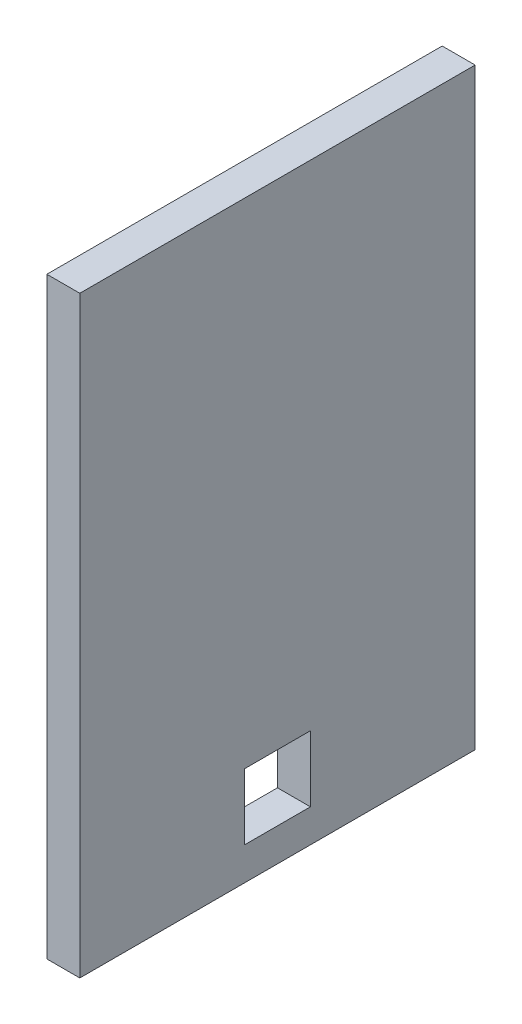
ISO-10303-21;
HEADER;
FILE_DESCRIPTION(('STEP AP214'),'2;1');
FILE_NAME('part.step','',(''),(''),'','','');
FILE_SCHEMA(('AUTOMOTIVE_DESIGN { 1 0 10303 214 1 1 1 1 }'));
ENDSEC;
DATA;
#1=APPLICATION_CONTEXT('core data for automotive mechanical design processes');
#2=APPLICATION_PROTOCOL_DEFINITION('international standard','automotive_design',2000,#1);
#3=PRODUCT_CONTEXT('',#1,'mechanical');
#4=PRODUCT('Part','Part','',(#3));
#5=PRODUCT_RELATED_PRODUCT_CATEGORY('part','',(#4));
#6=PRODUCT_DEFINITION_FORMATION('','',#4);
#7=PRODUCT_DEFINITION_CONTEXT('part definition',#1,'design');
#8=PRODUCT_DEFINITION('design','',#6,#7);
#9=PRODUCT_DEFINITION_SHAPE('','',#8);
#10=(LENGTH_UNIT() NAMED_UNIT(*) SI_UNIT(.MILLI.,.METRE.));
#11=(NAMED_UNIT(*) PLANE_ANGLE_UNIT() SI_UNIT($,.RADIAN.));
#12=(NAMED_UNIT(*) SI_UNIT($,.STERADIAN.) SOLID_ANGLE_UNIT());
#13=UNCERTAINTY_MEASURE_WITH_UNIT(LENGTH_MEASURE(1.E-05),#10,'distance_accuracy_value','');
#14=(GEOMETRIC_REPRESENTATION_CONTEXT(3) GLOBAL_UNCERTAINTY_ASSIGNED_CONTEXT((#13)) GLOBAL_UNIT_ASSIGNED_CONTEXT((#10,
#11,#12)) REPRESENTATION_CONTEXT('',''));
#15=CARTESIAN_POINT('',(0.,0.,0.));
#16=DIRECTION('',(0.,0.,1.));
#17=DIRECTION('',(1.,0.,0.));
#18=AXIS2_PLACEMENT_3D('',#15,#16,#17);
#19=CARTESIAN_POINT('',(-25.4,0.,152.4));
#20=DIRECTION('',(0.,0.,1.));
#21=DIRECTION('',(1.,0.,0.));
#22=AXIS2_PLACEMENT_3D('',#19,#20,#21);
#23=PLANE('',#22);
#24=DIRECTION('',(0.,-1.,0.));
#25=VECTOR('',#24,1.);
#26=CARTESIAN_POINT('',(0.,0.,152.4));
#27=LINE('',#26,#25);
#28=CARTESIAN_POINT('',(0.,457.2,152.4));
#29=VERTEX_POINT('',#28);
#30=CARTESIAN_POINT('',(0.,0.,152.4));
#31=VERTEX_POINT('',#30);
#32=EDGE_CURVE('E157',#29,#31,#27,.T.);
#33=ORIENTED_EDGE('',*,*,#32,.F.);
#34=DIRECTION('',(1.,0.,0.));
#35=VECTOR('',#34,1.);
#36=CARTESIAN_POINT('',(0.,457.2,152.4));
#37=LINE('',#36,#35);
#38=CARTESIAN_POINT('',(-25.4,457.2,152.4));
#39=VERTEX_POINT('',#38);
#40=EDGE_CURVE('E124',#39,#29,#37,.T.);
#41=ORIENTED_EDGE('',*,*,#40,.F.);
#42=DIRECTION('',(0.,-1.,0.));
#43=VECTOR('',#42,1.);
#44=CARTESIAN_POINT('',(-25.4,0.,152.4));
#45=LINE('',#44,#43);
#46=CARTESIAN_POINT('',(-25.4,0.,152.4));
#47=VERTEX_POINT('',#46);
#48=EDGE_CURVE('E109',#39,#47,#45,.T.);
#49=ORIENTED_EDGE('',*,*,#48,.T.);
#50=DIRECTION('',(1.,0.,0.));
#51=VECTOR('',#50,1.);
#52=CARTESIAN_POINT('',(-25.4,0.,152.4));
#53=LINE('',#52,#51);
#54=EDGE_CURVE('E38',#47,#31,#53,.T.);
#55=ORIENTED_EDGE('',*,*,#54,.T.);
#56=EDGE_LOOP('',(#33,#41,#49,#55));
#57=FACE_BOUND('',#56,.T.);
#58=ADVANCED_FACE('F35',(#57),#23,.T.);
#59=CARTESIAN_POINT('',(-25.4,0.,-152.4));
#60=DIRECTION('',(0.,0.,-1.));
#61=DIRECTION('',(0.,1.,0.));
#62=AXIS2_PLACEMENT_3D('',#59,#60,#61);
#63=PLANE('',#62);
#64=DIRECTION('',(0.,1.,0.));
#65=VECTOR('',#64,1.);
#66=CARTESIAN_POINT('',(0.,0.,-152.4));
#67=LINE('',#66,#65);
#68=CARTESIAN_POINT('',(0.,0.,-152.4));
#69=VERTEX_POINT('',#68);
#70=CARTESIAN_POINT('',(0.,457.2,-152.4));
#71=VERTEX_POINT('',#70);
#72=EDGE_CURVE('E100',#69,#71,#67,.T.);
#73=ORIENTED_EDGE('',*,*,#72,.F.);
#74=DIRECTION('',(1.,0.,0.));
#75=VECTOR('',#74,1.);
#76=CARTESIAN_POINT('',(-25.4,0.,-152.4));
#77=LINE('',#76,#75);
#78=CARTESIAN_POINT('',(-25.4,0.,-152.4));
#79=VERTEX_POINT('',#78);
#80=EDGE_CURVE('E11',#79,#69,#77,.T.);
#81=ORIENTED_EDGE('',*,*,#80,.F.);
#82=DIRECTION('',(0.,1.,0.));
#83=VECTOR('',#82,1.);
#84=CARTESIAN_POINT('',(-25.4,0.,-152.4));
#85=LINE('',#84,#83);
#86=CARTESIAN_POINT('',(-25.4,457.2,-152.4));
#87=VERTEX_POINT('',#86);
#88=EDGE_CURVE('E115',#79,#87,#85,.T.);
#89=ORIENTED_EDGE('',*,*,#88,.T.);
#90=DIRECTION('',(-1.,0.,0.));
#91=VECTOR('',#90,1.);
#92=CARTESIAN_POINT('',(0.,457.2,-152.4));
#93=LINE('',#92,#91);
#94=EDGE_CURVE('E112',#71,#87,#93,.T.);
#95=ORIENTED_EDGE('',*,*,#94,.F.);
#96=EDGE_LOOP('',(#73,#81,#89,#95));
#97=FACE_BOUND('',#96,.T.);
#98=ADVANCED_FACE('F113',(#97),#63,.T.);
#99=CARTESIAN_POINT('',(-25.4,0.,152.4));
#100=DIRECTION('',(0.,-1.,0.));
#101=DIRECTION('',(0.,0.,-1.));
#102=AXIS2_PLACEMENT_3D('',#99,#100,#101);
#103=PLANE('',#102);
#104=DIRECTION('',(0.,0.,-1.));
#105=VECTOR('',#104,1.);
#106=CARTESIAN_POINT('',(0.,0.,152.4));
#107=LINE('',#106,#105);
#108=EDGE_CURVE('E107',#31,#69,#107,.T.);
#109=ORIENTED_EDGE('',*,*,#108,.F.);
#110=ORIENTED_EDGE('',*,*,#54,.F.);
#111=DIRECTION('',(0.,0.,-1.));
#112=VECTOR('',#111,1.);
#113=CARTESIAN_POINT('',(-25.4,0.,152.4));
#114=LINE('',#113,#112);
#115=EDGE_CURVE('E160',#47,#79,#114,.T.);
#116=ORIENTED_EDGE('',*,*,#115,.T.);
#117=ORIENTED_EDGE('',*,*,#80,.T.);
#118=EDGE_LOOP('',(#109,#110,#116,#117));
#119=FACE_BOUND('',#118,.T.);
#120=ADVANCED_FACE('F168',(#119),#103,.T.);
#121=CARTESIAN_POINT('',(-25.4,0.,0.));
#122=DIRECTION('',(-1.,0.,0.));
#123=DIRECTION('',(0.,0.,1.));
#124=AXIS2_PLACEMENT_3D('',#121,#122,#123);
#125=PLANE('',#124);
#126=DIRECTION('',(0.,0.,1.));
#127=VECTOR('',#126,1.);
#128=CARTESIAN_POINT('',(-25.4,76.2,25.4));
#129=LINE('',#128,#127);
#130=CARTESIAN_POINT('',(-25.4,76.2,-25.4));
#131=VERTEX_POINT('',#130);
#132=CARTESIAN_POINT('',(-25.4,76.2,25.4));
#133=VERTEX_POINT('',#132);
#134=EDGE_CURVE('E131',#131,#133,#129,.T.);
#135=ORIENTED_EDGE('',*,*,#134,.T.);
#136=DIRECTION('',(0.,-1.,0.));
#137=VECTOR('',#136,1.);
#138=CARTESIAN_POINT('',(-25.4,25.4,25.4));
#139=LINE('',#138,#137);
#140=CARTESIAN_POINT('',(-25.4,25.4,25.4));
#141=VERTEX_POINT('',#140);
#142=EDGE_CURVE('E150',#133,#141,#139,.T.);
#143=ORIENTED_EDGE('',*,*,#142,.T.);
#144=DIRECTION('',(0.,0.,-1.));
#145=VECTOR('',#144,1.);
#146=CARTESIAN_POINT('',(-25.4,25.4,25.4));
#147=LINE('',#146,#145);
#148=CARTESIAN_POINT('',(-25.4,25.4,-25.4));
#149=VERTEX_POINT('',#148);
#150=EDGE_CURVE('E146',#141,#149,#147,.T.);
#151=ORIENTED_EDGE('',*,*,#150,.T.);
#152=DIRECTION('',(0.,1.,0.));
#153=VECTOR('',#152,1.);
#154=CARTESIAN_POINT('',(-25.4,25.4,-25.4));
#155=LINE('',#154,#153);
#156=EDGE_CURVE('E142',#149,#131,#155,.T.);
#157=ORIENTED_EDGE('',*,*,#156,.T.);
#158=EDGE_LOOP('',(#135,#143,#151,#157));
#159=FACE_BOUND('',#158,.T.);
#160=ORIENTED_EDGE('',*,*,#48,.F.);
#161=DIRECTION('',(0.,0.,1.));
#162=VECTOR('',#161,1.);
#163=CARTESIAN_POINT('',(-25.4,457.2,-152.4));
#164=LINE('',#163,#162);
#165=EDGE_CURVE('E119',#87,#39,#164,.T.);
#166=ORIENTED_EDGE('',*,*,#165,.F.);
#167=ORIENTED_EDGE('',*,*,#88,.F.);
#168=ORIENTED_EDGE('',*,*,#115,.F.);
#169=EDGE_LOOP('',(#160,#166,#167,#168));
#170=FACE_BOUND('',#169,.T.);
#171=ADVANCED_FACE('F170',(#159,#170),#125,.T.);
#172=CARTESIAN_POINT('',(0.,0.,0.));
#173=DIRECTION('',(-1.,0.,0.));
#174=DIRECTION('',(0.,0.,1.));
#175=AXIS2_PLACEMENT_3D('',#172,#173,#174);
#176=PLANE('',#175);
#177=DIRECTION('',(0.,-1.,0.));
#178=VECTOR('',#177,1.);
#179=CARTESIAN_POINT('',(0.,25.4,25.4));
#180=LINE('',#179,#178);
#181=CARTESIAN_POINT('',(0.,76.2,25.4));
#182=VERTEX_POINT('',#181);
#183=CARTESIAN_POINT('',(0.,25.4,25.4));
#184=VERTEX_POINT('',#183);
#185=EDGE_CURVE('E132',#182,#184,#180,.T.);
#186=ORIENTED_EDGE('',*,*,#185,.F.);
#187=DIRECTION('',(0.,0.,1.));
#188=VECTOR('',#187,1.);
#189=CARTESIAN_POINT('',(0.,76.2,25.4));
#190=LINE('',#189,#188);
#191=CARTESIAN_POINT('',(0.,76.2,-25.4));
#192=VERTEX_POINT('',#191);
#193=EDGE_CURVE('E135',#192,#182,#190,.T.);
#194=ORIENTED_EDGE('',*,*,#193,.F.);
#195=DIRECTION('',(0.,1.,0.));
#196=VECTOR('',#195,1.);
#197=CARTESIAN_POINT('',(0.,25.4,-25.4));
#198=LINE('',#197,#196);
#199=CARTESIAN_POINT('',(0.,25.4,-25.4));
#200=VERTEX_POINT('',#199);
#201=EDGE_CURVE('E129',#200,#192,#198,.T.);
#202=ORIENTED_EDGE('',*,*,#201,.F.);
#203=DIRECTION('',(0.,0.,-1.));
#204=VECTOR('',#203,1.);
#205=CARTESIAN_POINT('',(0.,25.4,25.4));
#206=LINE('',#205,#204);
#207=EDGE_CURVE('E57',#184,#200,#206,.T.);
#208=ORIENTED_EDGE('',*,*,#207,.F.);
#209=EDGE_LOOP('',(#186,#194,#202,#208));
#210=FACE_BOUND('',#209,.T.);
#211=ORIENTED_EDGE('',*,*,#32,.T.);
#212=ORIENTED_EDGE('',*,*,#108,.T.);
#213=ORIENTED_EDGE('',*,*,#72,.T.);
#214=DIRECTION('',(0.,0.,-1.));
#215=VECTOR('',#214,1.);
#216=CARTESIAN_POINT('',(0.,457.2,-152.4));
#217=LINE('',#216,#215);
#218=EDGE_CURVE('E105',#29,#71,#217,.T.);
#219=ORIENTED_EDGE('',*,*,#218,.F.);
#220=EDGE_LOOP('',(#211,#212,#213,#219));
#221=FACE_BOUND('',#220,.T.);
#222=ADVANCED_FACE('F103',(#210,#221),#176,.F.);
#223=CARTESIAN_POINT('',(-97.2420489685532,76.2,25.4));
#224=DIRECTION('',(0.,1.,0.));
#225=DIRECTION('',(0.,0.,1.));
#226=AXIS2_PLACEMENT_3D('',#223,#224,#225);
#227=PLANE('',#226);
#228=DIRECTION('',(1.,0.,0.));
#229=VECTOR('',#228,1.);
#230=CARTESIAN_POINT('',(-97.2420489685532,76.2,-25.4));
#231=LINE('',#230,#229);
#232=EDGE_CURVE('E49',#131,#192,#231,.T.);
#233=ORIENTED_EDGE('',*,*,#232,.T.);
#234=ORIENTED_EDGE('',*,*,#193,.T.);
#235=DIRECTION('',(1.,0.,0.));
#236=VECTOR('',#235,1.);
#237=CARTESIAN_POINT('',(-97.2420489685532,76.2,25.4));
#238=LINE('',#237,#236);
#239=EDGE_CURVE('E141',#133,#182,#238,.T.);
#240=ORIENTED_EDGE('',*,*,#239,.F.);
#241=ORIENTED_EDGE('',*,*,#134,.F.);
#242=EDGE_LOOP('',(#233,#234,#240,#241));
#243=FACE_BOUND('',#242,.T.);
#244=ADVANCED_FACE('F178',(#243),#227,.F.);
#245=CARTESIAN_POINT('',(-97.2420489685532,25.4,25.4));
#246=DIRECTION('',(0.,0.,1.));
#247=DIRECTION('',(0.,-1.,0.));
#248=AXIS2_PLACEMENT_3D('',#245,#246,#247);
#249=PLANE('',#248);
#250=ORIENTED_EDGE('',*,*,#239,.T.);
#251=ORIENTED_EDGE('',*,*,#185,.T.);
#252=DIRECTION('',(1.,0.,0.));
#253=VECTOR('',#252,1.);
#254=CARTESIAN_POINT('',(-97.2420489685532,25.4,25.4));
#255=LINE('',#254,#253);
#256=EDGE_CURVE('E149',#141,#184,#255,.T.);
#257=ORIENTED_EDGE('',*,*,#256,.F.);
#258=ORIENTED_EDGE('',*,*,#142,.F.);
#259=EDGE_LOOP('',(#250,#251,#257,#258));
#260=FACE_BOUND('',#259,.T.);
#261=ADVANCED_FACE('F204',(#260),#249,.F.);
#262=CARTESIAN_POINT('',(-97.2420489685532,25.4,25.4));
#263=DIRECTION('',(0.,-1.,0.));
#264=DIRECTION('',(0.,0.,-1.));
#265=AXIS2_PLACEMENT_3D('',#262,#263,#264);
#266=PLANE('',#265);
#267=ORIENTED_EDGE('',*,*,#256,.T.);
#268=ORIENTED_EDGE('',*,*,#207,.T.);
#269=DIRECTION('',(1.,0.,0.));
#270=VECTOR('',#269,1.);
#271=CARTESIAN_POINT('',(-97.2420489685532,25.4,-25.4));
#272=LINE('',#271,#270);
#273=EDGE_CURVE('E145',#149,#200,#272,.T.);
#274=ORIENTED_EDGE('',*,*,#273,.F.);
#275=ORIENTED_EDGE('',*,*,#150,.F.);
#276=EDGE_LOOP('',(#267,#268,#274,#275));
#277=FACE_BOUND('',#276,.T.);
#278=ADVANCED_FACE('F214',(#277),#266,.F.);
#279=CARTESIAN_POINT('',(-97.2420489685532,25.4,-25.4));
#280=DIRECTION('',(0.,0.,-1.));
#281=DIRECTION('',(0.,1.,0.));
#282=AXIS2_PLACEMENT_3D('',#279,#280,#281);
#283=PLANE('',#282);
#284=ORIENTED_EDGE('',*,*,#273,.T.);
#285=ORIENTED_EDGE('',*,*,#201,.T.);
#286=ORIENTED_EDGE('',*,*,#232,.F.);
#287=ORIENTED_EDGE('',*,*,#156,.F.);
#288=EDGE_LOOP('',(#284,#285,#286,#287));
#289=FACE_BOUND('',#288,.T.);
#290=ADVANCED_FACE('F224',(#289),#283,.F.);
#291=CARTESIAN_POINT('',(0.,457.2,0.));
#292=DIRECTION('',(0.,-1.,0.));
#293=DIRECTION('',(0.,0.,-1.));
#294=AXIS2_PLACEMENT_3D('',#291,#292,#293);
#295=PLANE('',#294);
#296=ORIENTED_EDGE('',*,*,#218,.T.);
#297=ORIENTED_EDGE('',*,*,#94,.T.);
#298=ORIENTED_EDGE('',*,*,#165,.T.);
#299=ORIENTED_EDGE('',*,*,#40,.T.);
#300=EDGE_LOOP('',(#296,#297,#298,#299));
#301=FACE_BOUND('',#300,.T.);
#302=ADVANCED_FACE('F122',(#301),#295,.F.);
#303=CLOSED_SHELL('',(#58,#98,#120,#171,#222,#244,#261,#278,#290,#302));
#304=MANIFOLD_SOLID_BREP('B2',#303);
#305=ADVANCED_BREP_SHAPE_REPRESENTATION('',(#18,#304),#14);
#306=SHAPE_DEFINITION_REPRESENTATION(#9,#305);
ENDSEC;
END-ISO-10303-21;
